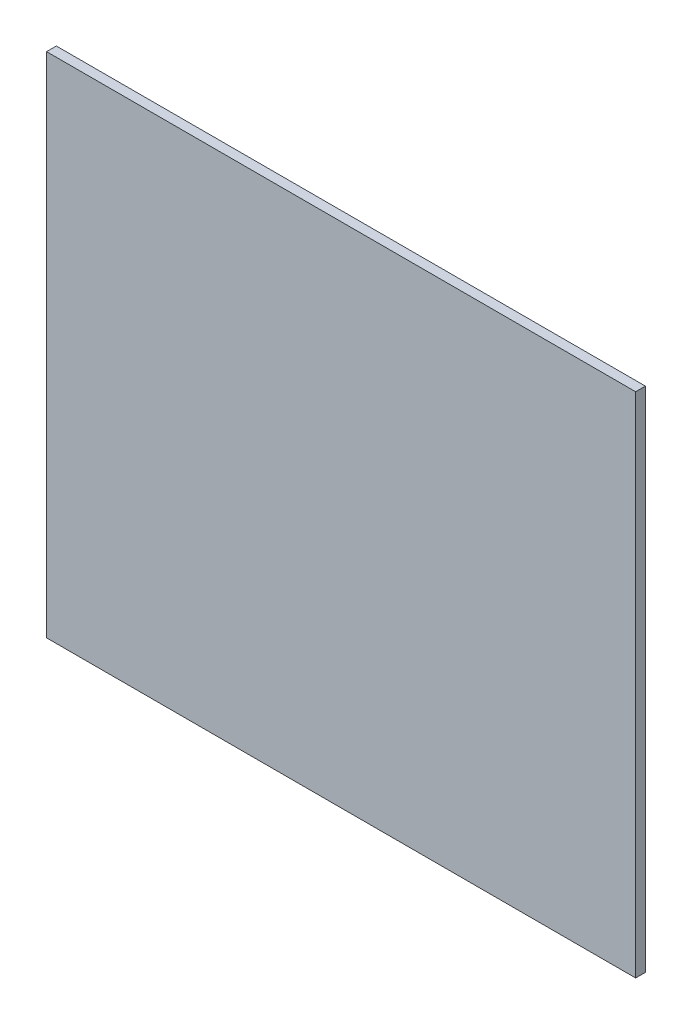
ISO-10303-21;
HEADER;
FILE_DESCRIPTION(('STEP AP214'),'2;1');
FILE_NAME('part.step','',(''),(''),'','','');
FILE_SCHEMA(('AUTOMOTIVE_DESIGN { 1 0 10303 214 1 1 1 1 }'));
ENDSEC;
DATA;
#1=APPLICATION_CONTEXT('core data for automotive mechanical design processes');
#2=APPLICATION_PROTOCOL_DEFINITION('international standard','automotive_design',2000,#1);
#3=PRODUCT_CONTEXT('',#1,'mechanical');
#4=PRODUCT('Part','Part','',(#3));
#5=PRODUCT_RELATED_PRODUCT_CATEGORY('part','',(#4));
#6=PRODUCT_DEFINITION_FORMATION('','',#4);
#7=PRODUCT_DEFINITION_CONTEXT('part definition',#1,'design');
#8=PRODUCT_DEFINITION('design','',#6,#7);
#9=PRODUCT_DEFINITION_SHAPE('','',#8);
#10=(LENGTH_UNIT() NAMED_UNIT(*) SI_UNIT(.MILLI.,.METRE.));
#11=(NAMED_UNIT(*) PLANE_ANGLE_UNIT() SI_UNIT($,.RADIAN.));
#12=(NAMED_UNIT(*) SI_UNIT($,.STERADIAN.) SOLID_ANGLE_UNIT());
#13=UNCERTAINTY_MEASURE_WITH_UNIT(LENGTH_MEASURE(1.E-05),#10,'distance_accuracy_value','');
#14=(GEOMETRIC_REPRESENTATION_CONTEXT(3) GLOBAL_UNCERTAINTY_ASSIGNED_CONTEXT((#13)) GLOBAL_UNIT_ASSIGNED_CONTEXT((#10,
#11,#12)) REPRESENTATION_CONTEXT('',''));
#15=CARTESIAN_POINT('',(0.,0.,0.));
#16=DIRECTION('',(0.,0.,1.));
#17=DIRECTION('',(1.,0.,0.));
#18=AXIS2_PLACEMENT_3D('',#15,#16,#17);
#19=CARTESIAN_POINT('',(168.,143.,13.));
#20=DIRECTION('',(0.,-1.,0.));
#21=DIRECTION('',(0.,0.,-1.));
#22=AXIS2_PLACEMENT_3D('',#19,#20,#21);
#23=PLANE('',#22);
#24=DIRECTION('',(-1.,0.,0.));
#25=VECTOR('',#24,1.);
#26=CARTESIAN_POINT('',(168.,143.,10.));
#27=LINE('',#26,#25);
#28=CARTESIAN_POINT('',(168.,143.,10.));
#29=VERTEX_POINT('',#28);
#30=CARTESIAN_POINT('',(-13.,143.,10.));
#31=VERTEX_POINT('',#30);
#32=EDGE_CURVE('E96',#29,#31,#27,.T.);
#33=ORIENTED_EDGE('',*,*,#32,.T.);
#34=DIRECTION('',(0.,0.,-1.));
#35=VECTOR('',#34,1.);
#36=CARTESIAN_POINT('',(-13.,143.,13.));
#37=LINE('',#36,#35);
#38=CARTESIAN_POINT('',(-13.,143.,13.));
#39=VERTEX_POINT('',#38);
#40=EDGE_CURVE('E11',#39,#31,#37,.T.);
#41=ORIENTED_EDGE('',*,*,#40,.F.);
#42=DIRECTION('',(-1.,0.,0.));
#43=VECTOR('',#42,1.);
#44=CARTESIAN_POINT('',(168.,143.,13.));
#45=LINE('',#44,#43);
#46=CARTESIAN_POINT('',(168.,143.,13.));
#47=VERTEX_POINT('',#46);
#48=EDGE_CURVE('E84',#47,#39,#45,.T.);
#49=ORIENTED_EDGE('',*,*,#48,.F.);
#50=DIRECTION('',(0.,0.,-1.));
#51=VECTOR('',#50,1.);
#52=CARTESIAN_POINT('',(168.,143.,13.));
#53=LINE('',#52,#51);
#54=EDGE_CURVE('E92',#47,#29,#53,.T.);
#55=ORIENTED_EDGE('',*,*,#54,.T.);
#56=EDGE_LOOP('',(#33,#41,#49,#55));
#57=FACE_BOUND('',#56,.T.);
#58=ADVANCED_FACE('F33',(#57),#23,.F.);
#59=CARTESIAN_POINT('',(-13.,143.,13.));
#60=DIRECTION('',(1.,0.,0.));
#61=DIRECTION('',(0.,0.,-1.));
#62=AXIS2_PLACEMENT_3D('',#59,#60,#61);
#63=PLANE('',#62);
#64=DIRECTION('',(0.,-1.,0.));
#65=VECTOR('',#64,1.);
#66=CARTESIAN_POINT('',(-13.,143.,10.));
#67=LINE('',#66,#65);
#68=CARTESIAN_POINT('',(-13.,-13.,10.));
#69=VERTEX_POINT('',#68);
#70=EDGE_CURVE('E88',#31,#69,#67,.T.);
#71=ORIENTED_EDGE('',*,*,#70,.T.);
#72=DIRECTION('',(0.,0.,-1.));
#73=VECTOR('',#72,1.);
#74=CARTESIAN_POINT('',(-13.,-13.,13.));
#75=LINE('',#74,#73);
#76=CARTESIAN_POINT('',(-13.,-13.,13.));
#77=VERTEX_POINT('',#76);
#78=EDGE_CURVE('E41',#77,#69,#75,.T.);
#79=ORIENTED_EDGE('',*,*,#78,.F.);
#80=DIRECTION('',(0.,-1.,0.));
#81=VECTOR('',#80,1.);
#82=CARTESIAN_POINT('',(-13.,143.,13.));
#83=LINE('',#82,#81);
#84=EDGE_CURVE('E79',#39,#77,#83,.T.);
#85=ORIENTED_EDGE('',*,*,#84,.F.);
#86=ORIENTED_EDGE('',*,*,#40,.T.);
#87=EDGE_LOOP('',(#71,#79,#85,#86));
#88=FACE_BOUND('',#87,.T.);
#89=ADVANCED_FACE('F87',(#88),#63,.F.);
#90=CARTESIAN_POINT('',(-13.,-13.,13.));
#91=DIRECTION('',(0.,1.,0.));
#92=DIRECTION('',(0.,0.,1.));
#93=AXIS2_PLACEMENT_3D('',#90,#91,#92);
#94=PLANE('',#93);
#95=DIRECTION('',(1.,0.,0.));
#96=VECTOR('',#95,1.);
#97=CARTESIAN_POINT('',(-13.,-13.,10.));
#98=LINE('',#97,#96);
#99=CARTESIAN_POINT('',(168.,-13.,10.));
#100=VERTEX_POINT('',#99);
#101=EDGE_CURVE('E66',#69,#100,#98,.T.);
#102=ORIENTED_EDGE('',*,*,#101,.T.);
#103=DIRECTION('',(0.,0.,-1.));
#104=VECTOR('',#103,1.);
#105=CARTESIAN_POINT('',(168.,-13.,13.));
#106=LINE('',#105,#104);
#107=CARTESIAN_POINT('',(168.,-13.,13.));
#108=VERTEX_POINT('',#107);
#109=EDGE_CURVE('E89',#108,#100,#106,.T.);
#110=ORIENTED_EDGE('',*,*,#109,.F.);
#111=DIRECTION('',(1.,0.,0.));
#112=VECTOR('',#111,1.);
#113=CARTESIAN_POINT('',(-13.,-13.,13.));
#114=LINE('',#113,#112);
#115=EDGE_CURVE('E82',#77,#108,#114,.T.);
#116=ORIENTED_EDGE('',*,*,#115,.F.);
#117=ORIENTED_EDGE('',*,*,#78,.T.);
#118=EDGE_LOOP('',(#102,#110,#116,#117));
#119=FACE_BOUND('',#118,.T.);
#120=ADVANCED_FACE('F90',(#119),#94,.F.);
#121=CARTESIAN_POINT('',(168.,-13.,13.));
#122=DIRECTION('',(-1.,0.,0.));
#123=DIRECTION('',(0.,0.,1.));
#124=AXIS2_PLACEMENT_3D('',#121,#122,#123);
#125=PLANE('',#124);
#126=DIRECTION('',(0.,1.,0.));
#127=VECTOR('',#126,1.);
#128=CARTESIAN_POINT('',(168.,-13.,10.));
#129=LINE('',#128,#127);
#130=EDGE_CURVE('E72',#100,#29,#129,.T.);
#131=ORIENTED_EDGE('',*,*,#130,.T.);
#132=ORIENTED_EDGE('',*,*,#54,.F.);
#133=DIRECTION('',(0.,1.,0.));
#134=VECTOR('',#133,1.);
#135=CARTESIAN_POINT('',(168.,-13.,13.));
#136=LINE('',#135,#134);
#137=EDGE_CURVE('E49',#108,#47,#136,.T.);
#138=ORIENTED_EDGE('',*,*,#137,.F.);
#139=ORIENTED_EDGE('',*,*,#109,.T.);
#140=EDGE_LOOP('',(#131,#132,#138,#139));
#141=FACE_BOUND('',#140,.T.);
#142=ADVANCED_FACE('F103',(#141),#125,.F.);
#143=CARTESIAN_POINT('',(0.,0.,13.));
#144=DIRECTION('',(0.,0.,1.));
#145=DIRECTION('',(1.,0.,0.));
#146=AXIS2_PLACEMENT_3D('',#143,#144,#145);
#147=PLANE('',#146);
#148=ORIENTED_EDGE('',*,*,#48,.T.);
#149=ORIENTED_EDGE('',*,*,#84,.T.);
#150=ORIENTED_EDGE('',*,*,#115,.T.);
#151=ORIENTED_EDGE('',*,*,#137,.T.);
#152=EDGE_LOOP('',(#148,#149,#150,#151));
#153=FACE_BOUND('',#152,.T.);
#154=ADVANCED_FACE('F80',(#153),#147,.T.);
#155=CARTESIAN_POINT('',(0.,0.,10.));
#156=DIRECTION('',(0.,0.,1.));
#157=DIRECTION('',(1.,0.,0.));
#158=AXIS2_PLACEMENT_3D('',#155,#156,#157);
#159=PLANE('',#158);
#160=ORIENTED_EDGE('',*,*,#32,.F.);
#161=ORIENTED_EDGE('',*,*,#130,.F.);
#162=ORIENTED_EDGE('',*,*,#101,.F.);
#163=ORIENTED_EDGE('',*,*,#70,.F.);
#164=EDGE_LOOP('',(#160,#161,#162,#163));
#165=FACE_BOUND('',#164,.T.);
#166=ADVANCED_FACE('F106',(#165),#159,.F.);
#167=CLOSED_SHELL('',(#58,#89,#120,#142,#154,#166));
#168=MANIFOLD_SOLID_BREP('B2',#167);
#169=ADVANCED_BREP_SHAPE_REPRESENTATION('',(#18,#168),#14);
#170=SHAPE_DEFINITION_REPRESENTATION(#9,#169);
ENDSEC;
END-ISO-10303-21;
